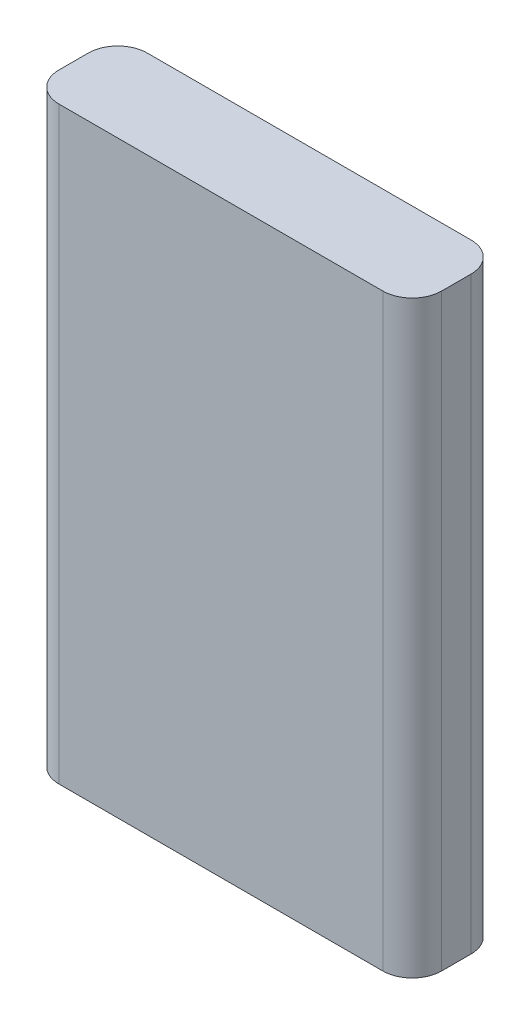
ISO-10303-21;
HEADER;
FILE_DESCRIPTION(('STEP AP214'),'2;1');
FILE_NAME('part.step','',(''),(''),'','','');
FILE_SCHEMA(('AUTOMOTIVE_DESIGN { 1 0 10303 214 1 1 1 1 }'));
ENDSEC;
DATA;
#1=APPLICATION_CONTEXT('core data for automotive mechanical design processes');
#2=APPLICATION_PROTOCOL_DEFINITION('international standard','automotive_design',2000,#1);
#3=PRODUCT_CONTEXT('',#1,'mechanical');
#4=PRODUCT('Part','Part','',(#3));
#5=PRODUCT_RELATED_PRODUCT_CATEGORY('part','',(#4));
#6=PRODUCT_DEFINITION_FORMATION('','',#4);
#7=PRODUCT_DEFINITION_CONTEXT('part definition',#1,'design');
#8=PRODUCT_DEFINITION('design','',#6,#7);
#9=PRODUCT_DEFINITION_SHAPE('','',#8);
#10=(LENGTH_UNIT() NAMED_UNIT(*) SI_UNIT(.MILLI.,.METRE.));
#11=(NAMED_UNIT(*) PLANE_ANGLE_UNIT() SI_UNIT($,.RADIAN.));
#12=(NAMED_UNIT(*) SI_UNIT($,.STERADIAN.) SOLID_ANGLE_UNIT());
#13=UNCERTAINTY_MEASURE_WITH_UNIT(LENGTH_MEASURE(1.E-05),#10,'distance_accuracy_value','');
#14=(GEOMETRIC_REPRESENTATION_CONTEXT(3) GLOBAL_UNCERTAINTY_ASSIGNED_CONTEXT((#13)) GLOBAL_UNIT_ASSIGNED_CONTEXT((#10,
#11,#12)) REPRESENTATION_CONTEXT('',''));
#15=CARTESIAN_POINT('',(0.,0.,0.));
#16=DIRECTION('',(0.,0.,1.));
#17=DIRECTION('',(1.,0.,0.));
#18=AXIS2_PLACEMENT_3D('',#15,#16,#17);
#19=CARTESIAN_POINT('',(-19.6449704142012,9.82248520710059,3.));
#20=DIRECTION('',(1.,0.,0.));
#21=DIRECTION('',(0.,0.,-1.));
#22=AXIS2_PLACEMENT_3D('',#19,#20,#21);
#23=PLANE('',#22);
#24=DIRECTION('',(0.,0.,-1.));
#25=VECTOR('',#24,1.);
#26=CARTESIAN_POINT('',(-19.6449704142012,9.82248520710059,3.));
#27=LINE('',#26,#25);
#28=CARTESIAN_POINT('',(-19.6449704142012,9.82248520710059,2.));
#29=VERTEX_POINT('',#28);
#30=CARTESIAN_POINT('',(-19.6449704142012,9.82248520710059,1.));
#31=VERTEX_POINT('',#30);
#32=EDGE_CURVE('E121',#29,#31,#27,.T.);
#33=ORIENTED_EDGE('',*,*,#32,.T.);
#34=DIRECTION('',(0.,-1.,0.));
#35=VECTOR('',#34,1.);
#36=CARTESIAN_POINT('',(-19.6449704142012,9.82248520710059,1.));
#37=LINE('',#36,#35);
#38=CARTESIAN_POINT('',(-19.6449704142012,-10.1775147928994,1.));
#39=VERTEX_POINT('',#38);
#40=EDGE_CURVE('E11',#31,#39,#37,.T.);
#41=ORIENTED_EDGE('',*,*,#40,.T.);
#42=DIRECTION('',(0.,0.,-1.));
#43=VECTOR('',#42,1.);
#44=CARTESIAN_POINT('',(-19.6449704142012,-10.1775147928994,3.));
#45=LINE('',#44,#43);
#46=CARTESIAN_POINT('',(-19.6449704142012,-10.1775147928994,2.));
#47=VERTEX_POINT('',#46);
#48=EDGE_CURVE('E126',#47,#39,#45,.T.);
#49=ORIENTED_EDGE('',*,*,#48,.F.);
#50=DIRECTION('',(0.,-1.,0.));
#51=VECTOR('',#50,1.);
#52=CARTESIAN_POINT('',(-19.6449704142012,9.82248520710059,2.));
#53=LINE('',#52,#51);
#54=EDGE_CURVE('E41',#47,#29,#53,.F.);
#55=ORIENTED_EDGE('',*,*,#54,.T.);
#56=EDGE_LOOP('',(#33,#41,#49,#55));
#57=FACE_BOUND('',#56,.T.);
#58=ADVANCED_FACE('F33',(#57),#23,.F.);
#59=CARTESIAN_POINT('',(-19.6449704142012,-10.1775147928994,3.));
#60=DIRECTION('',(0.,1.,0.));
#61=DIRECTION('',(-1.,0.,0.));
#62=AXIS2_PLACEMENT_3D('',#59,#60,#61);
#63=PLANE('',#62);
#64=DIRECTION('',(1.,0.,0.));
#65=VECTOR('',#64,1.);
#66=CARTESIAN_POINT('',(-19.6449704142012,-10.1775147928994,0.));
#67=LINE('',#66,#65);
#68=CARTESIAN_POINT('',(-18.6449704142012,-10.1775147928994,0.));
#69=VERTEX_POINT('',#68);
#70=CARTESIAN_POINT('',(-7.64497041420119,-10.1775147928994,0.));
#71=VERTEX_POINT('',#70);
#72=EDGE_CURVE('E168',#69,#71,#67,.T.);
#73=ORIENTED_EDGE('',*,*,#72,.T.);
#74=CARTESIAN_POINT('',(-7.64497041420119,-10.1775147928994,1.));
#75=DIRECTION('',(0.,1.,0.));
#76=DIRECTION('',(-1.,0.,0.));
#77=AXIS2_PLACEMENT_3D('',#74,#75,#76);
#78=CIRCLE('',#77,1.);
#79=CARTESIAN_POINT('',(-6.64497041420119,-10.1775147928994,1.));
#80=VERTEX_POINT('',#79);
#81=EDGE_CURVE('E143',#71,#80,#78,.F.);
#82=ORIENTED_EDGE('',*,*,#81,.T.);
#83=DIRECTION('',(0.,0.,-1.));
#84=VECTOR('',#83,1.);
#85=CARTESIAN_POINT('',(-6.64497041420119,-10.1775147928994,3.));
#86=LINE('',#85,#84);
#87=CARTESIAN_POINT('',(-6.64497041420119,-10.1775147928994,2.));
#88=VERTEX_POINT('',#87);
#89=EDGE_CURVE('E120',#88,#80,#86,.T.);
#90=ORIENTED_EDGE('',*,*,#89,.F.);
#91=CARTESIAN_POINT('',(-7.64497041420119,-10.1775147928994,2.));
#92=DIRECTION('',(0.,1.,0.));
#93=DIRECTION('',(-1.,0.,0.));
#94=AXIS2_PLACEMENT_3D('',#91,#92,#93);
#95=CIRCLE('',#94,1.);
#96=CARTESIAN_POINT('',(-7.64497041420119,-10.1775147928994,3.));
#97=VERTEX_POINT('',#96);
#98=EDGE_CURVE('E125',#88,#97,#95,.F.);
#99=ORIENTED_EDGE('',*,*,#98,.T.);
#100=DIRECTION('',(1.,0.,0.));
#101=VECTOR('',#100,1.);
#102=CARTESIAN_POINT('',(-19.6449704142012,-10.1775147928994,3.));
#103=LINE('',#102,#101);
#104=CARTESIAN_POINT('',(-18.6449704142012,-10.1775147928994,3.));
#105=VERTEX_POINT('',#104);
#106=EDGE_CURVE('E162',#105,#97,#103,.T.);
#107=ORIENTED_EDGE('',*,*,#106,.F.);
#108=CARTESIAN_POINT('',(-18.6449704142012,-10.1775147928994,2.));
#109=DIRECTION('',(0.,1.,0.));
#110=DIRECTION('',(-1.,0.,0.));
#111=AXIS2_PLACEMENT_3D('',#108,#109,#110);
#112=CIRCLE('',#111,1.);
#113=EDGE_CURVE('E55',#105,#47,#112,.F.);
#114=ORIENTED_EDGE('',*,*,#113,.T.);
#115=ORIENTED_EDGE('',*,*,#48,.T.);
#116=CARTESIAN_POINT('',(-18.6449704142012,-10.1775147928994,1.));
#117=DIRECTION('',(0.,1.,0.));
#118=DIRECTION('',(-1.,0.,0.));
#119=AXIS2_PLACEMENT_3D('',#116,#117,#118);
#120=CIRCLE('',#119,1.);
#121=EDGE_CURVE('E48',#39,#69,#120,.F.);
#122=ORIENTED_EDGE('',*,*,#121,.T.);
#123=EDGE_LOOP('',(#73,#82,#90,#99,#107,#114,#115,#122));
#124=FACE_BOUND('',#123,.T.);
#125=ADVANCED_FACE('F164',(#124),#63,.F.);
#126=CARTESIAN_POINT('',(-6.64497041420119,9.82248520710059,3.));
#127=DIRECTION('',(-1.,0.,0.));
#128=DIRECTION('',(0.,-1.,0.));
#129=AXIS2_PLACEMENT_3D('',#126,#127,#128);
#130=PLANE('',#129);
#131=ORIENTED_EDGE('',*,*,#89,.T.);
#132=DIRECTION('',(0.,1.,0.));
#133=VECTOR('',#132,1.);
#134=CARTESIAN_POINT('',(-6.64497041420119,9.82248520710059,1.));
#135=LINE('',#134,#133);
#136=CARTESIAN_POINT('',(-6.64497041420119,9.82248520710059,1.));
#137=VERTEX_POINT('',#136);
#138=EDGE_CURVE('E119',#80,#137,#135,.T.);
#139=ORIENTED_EDGE('',*,*,#138,.T.);
#140=DIRECTION('',(0.,0.,-1.));
#141=VECTOR('',#140,1.);
#142=CARTESIAN_POINT('',(-6.64497041420119,9.82248520710059,3.));
#143=LINE('',#142,#141);
#144=CARTESIAN_POINT('',(-6.64497041420119,9.82248520710059,2.));
#145=VERTEX_POINT('',#144);
#146=EDGE_CURVE('E102',#145,#137,#143,.T.);
#147=ORIENTED_EDGE('',*,*,#146,.F.);
#148=DIRECTION('',(0.,1.,0.));
#149=VECTOR('',#148,1.);
#150=CARTESIAN_POINT('',(-6.64497041420119,-10.1775147928994,2.));
#151=LINE('',#150,#149);
#152=EDGE_CURVE('E116',#145,#88,#151,.F.);
#153=ORIENTED_EDGE('',*,*,#152,.T.);
#154=EDGE_LOOP('',(#131,#139,#147,#153));
#155=FACE_BOUND('',#154,.T.);
#156=ADVANCED_FACE('F115',(#155),#130,.F.);
#157=CARTESIAN_POINT('',(-19.6449704142012,9.82248520710059,3.));
#158=DIRECTION('',(0.,-1.,0.));
#159=DIRECTION('',(0.,0.,-1.));
#160=AXIS2_PLACEMENT_3D('',#157,#158,#159);
#161=PLANE('',#160);
#162=ORIENTED_EDGE('',*,*,#146,.T.);
#163=CARTESIAN_POINT('',(-7.64497041420119,9.82248520710059,1.));
#164=DIRECTION('',(0.,-1.,0.));
#165=DIRECTION('',(0.,0.,-1.));
#166=AXIS2_PLACEMENT_3D('',#163,#164,#165);
#167=CIRCLE('',#166,1.);
#168=CARTESIAN_POINT('',(-7.64497041420119,9.82248520710059,0.));
#169=VERTEX_POINT('',#168);
#170=EDGE_CURVE('E109',#137,#169,#167,.F.);
#171=ORIENTED_EDGE('',*,*,#170,.T.);
#172=DIRECTION('',(-1.,0.,0.));
#173=VECTOR('',#172,1.);
#174=CARTESIAN_POINT('',(-19.6449704142012,9.82248520710059,0.));
#175=LINE('',#174,#173);
#176=CARTESIAN_POINT('',(-18.6449704142012,9.82248520710059,0.));
#177=VERTEX_POINT('',#176);
#178=EDGE_CURVE('E165',#169,#177,#175,.T.);
#179=ORIENTED_EDGE('',*,*,#178,.T.);
#180=CARTESIAN_POINT('',(-18.6449704142012,9.82248520710059,1.));
#181=DIRECTION('',(0.,-1.,0.));
#182=DIRECTION('',(0.,0.,-1.));
#183=AXIS2_PLACEMENT_3D('',#180,#181,#182);
#184=CIRCLE('',#183,1.);
#185=EDGE_CURVE('E110',#177,#31,#184,.F.);
#186=ORIENTED_EDGE('',*,*,#185,.T.);
#187=ORIENTED_EDGE('',*,*,#32,.F.);
#188=CARTESIAN_POINT('',(-18.6449704142012,9.82248520710059,2.));
#189=DIRECTION('',(0.,-1.,0.));
#190=DIRECTION('',(0.,0.,-1.));
#191=AXIS2_PLACEMENT_3D('',#188,#189,#190);
#192=CIRCLE('',#191,1.);
#193=CARTESIAN_POINT('',(-18.6449704142012,9.82248520710059,3.));
#194=VERTEX_POINT('',#193);
#195=EDGE_CURVE('E128',#29,#194,#192,.F.);
#196=ORIENTED_EDGE('',*,*,#195,.T.);
#197=DIRECTION('',(-1.,0.,0.));
#198=VECTOR('',#197,1.);
#199=CARTESIAN_POINT('',(-19.6449704142012,9.82248520710059,3.));
#200=LINE('',#199,#198);
#201=CARTESIAN_POINT('',(-7.64497041420119,9.82248520710059,3.));
#202=VERTEX_POINT('',#201);
#203=EDGE_CURVE('E104',#202,#194,#200,.T.);
#204=ORIENTED_EDGE('',*,*,#203,.F.);
#205=CARTESIAN_POINT('',(-7.64497041420119,9.82248520710059,2.));
#206=DIRECTION('',(0.,-1.,0.));
#207=DIRECTION('',(0.,0.,-1.));
#208=AXIS2_PLACEMENT_3D('',#205,#206,#207);
#209=CIRCLE('',#208,1.);
#210=EDGE_CURVE('E99',#202,#145,#209,.F.);
#211=ORIENTED_EDGE('',*,*,#210,.T.);
#212=EDGE_LOOP('',(#162,#171,#179,#186,#187,#196,#204,#211));
#213=FACE_BOUND('',#212,.T.);
#214=ADVANCED_FACE('F101',(#213),#161,.F.);
#215=CARTESIAN_POINT('',(0.,0.,3.));
#216=DIRECTION('',(0.,0.,1.));
#217=DIRECTION('',(1.,0.,0.));
#218=AXIS2_PLACEMENT_3D('',#215,#216,#217);
#219=PLANE('',#218);
#220=ORIENTED_EDGE('',*,*,#106,.T.);
#221=DIRECTION('',(0.,1.,0.));
#222=VECTOR('',#221,1.);
#223=CARTESIAN_POINT('',(-7.64497041420119,9.82248520710059,3.));
#224=LINE('',#223,#222);
#225=EDGE_CURVE('E148',#97,#202,#224,.T.);
#226=ORIENTED_EDGE('',*,*,#225,.T.);
#227=ORIENTED_EDGE('',*,*,#203,.T.);
#228=DIRECTION('',(0.,-1.,0.));
#229=VECTOR('',#228,1.);
#230=CARTESIAN_POINT('',(-18.6449704142012,-10.1775147928994,3.));
#231=LINE('',#230,#229);
#232=EDGE_CURVE('E145',#194,#105,#231,.T.);
#233=ORIENTED_EDGE('',*,*,#232,.T.);
#234=EDGE_LOOP('',(#220,#226,#227,#233));
#235=FACE_BOUND('',#234,.T.);
#236=ADVANCED_FACE('F161',(#235),#219,.T.);
#237=CARTESIAN_POINT('',(0.,0.,0.));
#238=DIRECTION('',(0.,0.,1.));
#239=DIRECTION('',(1.,0.,0.));
#240=AXIS2_PLACEMENT_3D('',#237,#238,#239);
#241=PLANE('',#240);
#242=ORIENTED_EDGE('',*,*,#178,.F.);
#243=DIRECTION('',(0.,1.,0.));
#244=VECTOR('',#243,1.);
#245=CARTESIAN_POINT('',(-7.64497041420119,0.,0.));
#246=LINE('',#245,#244);
#247=EDGE_CURVE('E138',#169,#71,#246,.F.);
#248=ORIENTED_EDGE('',*,*,#247,.T.);
#249=ORIENTED_EDGE('',*,*,#72,.F.);
#250=DIRECTION('',(0.,-1.,0.));
#251=VECTOR('',#250,1.);
#252=CARTESIAN_POINT('',(-18.6449704142012,0.,0.));
#253=LINE('',#252,#251);
#254=EDGE_CURVE('E136',#69,#177,#253,.F.);
#255=ORIENTED_EDGE('',*,*,#254,.T.);
#256=EDGE_LOOP('',(#242,#248,#249,#255));
#257=FACE_BOUND('',#256,.T.);
#258=ADVANCED_FACE('F177',(#257),#241,.F.);
#259=CARTESIAN_POINT('',(-7.64497041420119,9.82248520710059,1.));
#260=DIRECTION('',(0.,1.,0.));
#261=DIRECTION('',(-1.,0.,0.));
#262=AXIS2_PLACEMENT_3D('',#259,#260,#261);
#263=CYLINDRICAL_SURFACE('',#262,1.);
#264=ORIENTED_EDGE('',*,*,#81,.F.);
#265=ORIENTED_EDGE('',*,*,#247,.F.);
#266=ORIENTED_EDGE('',*,*,#170,.F.);
#267=ORIENTED_EDGE('',*,*,#138,.F.);
#268=EDGE_LOOP('',(#264,#265,#266,#267));
#269=FACE_BOUND('',#268,.T.);
#270=ADVANCED_FACE('F173',(#269),#263,.T.);
#271=CARTESIAN_POINT('',(-7.64497041420119,0.,2.));
#272=DIRECTION('',(0.,-1.,0.));
#273=DIRECTION('',(1.,0.,0.));
#274=AXIS2_PLACEMENT_3D('',#271,#272,#273);
#275=CYLINDRICAL_SURFACE('',#274,1.);
#276=ORIENTED_EDGE('',*,*,#98,.F.);
#277=ORIENTED_EDGE('',*,*,#152,.F.);
#278=ORIENTED_EDGE('',*,*,#210,.F.);
#279=ORIENTED_EDGE('',*,*,#225,.F.);
#280=EDGE_LOOP('',(#276,#277,#278,#279));
#281=FACE_BOUND('',#280,.T.);
#282=ADVANCED_FACE('F124',(#281),#275,.T.);
#283=CARTESIAN_POINT('',(-18.6449704142012,9.82248520710059,1.));
#284=DIRECTION('',(0.,-1.,0.));
#285=DIRECTION('',(0.,0.,-1.));
#286=AXIS2_PLACEMENT_3D('',#283,#284,#285);
#287=CYLINDRICAL_SURFACE('',#286,1.);
#288=ORIENTED_EDGE('',*,*,#185,.F.);
#289=ORIENTED_EDGE('',*,*,#254,.F.);
#290=ORIENTED_EDGE('',*,*,#121,.F.);
#291=ORIENTED_EDGE('',*,*,#40,.F.);
#292=EDGE_LOOP('',(#288,#289,#290,#291));
#293=FACE_BOUND('',#292,.T.);
#294=ADVANCED_FACE('F179',(#293),#287,.T.);
#295=CARTESIAN_POINT('',(-18.6449704142012,0.,2.));
#296=DIRECTION('',(0.,1.,0.));
#297=DIRECTION('',(0.,0.,1.));
#298=AXIS2_PLACEMENT_3D('',#295,#296,#297);
#299=CYLINDRICAL_SURFACE('',#298,1.);
#300=ORIENTED_EDGE('',*,*,#195,.F.);
#301=ORIENTED_EDGE('',*,*,#54,.F.);
#302=ORIENTED_EDGE('',*,*,#113,.F.);
#303=ORIENTED_EDGE('',*,*,#232,.F.);
#304=EDGE_LOOP('',(#300,#301,#302,#303));
#305=FACE_BOUND('',#304,.T.);
#306=ADVANCED_FACE('F35',(#305),#299,.T.);
#307=CLOSED_SHELL('',(#58,#125,#156,#214,#236,#258,#270,#282,#294,#306));
#308=MANIFOLD_SOLID_BREP('B2',#307);
#309=ADVANCED_BREP_SHAPE_REPRESENTATION('',(#18,#308),#14);
#310=SHAPE_DEFINITION_REPRESENTATION(#9,#309);
ENDSEC;
END-ISO-10303-21;
